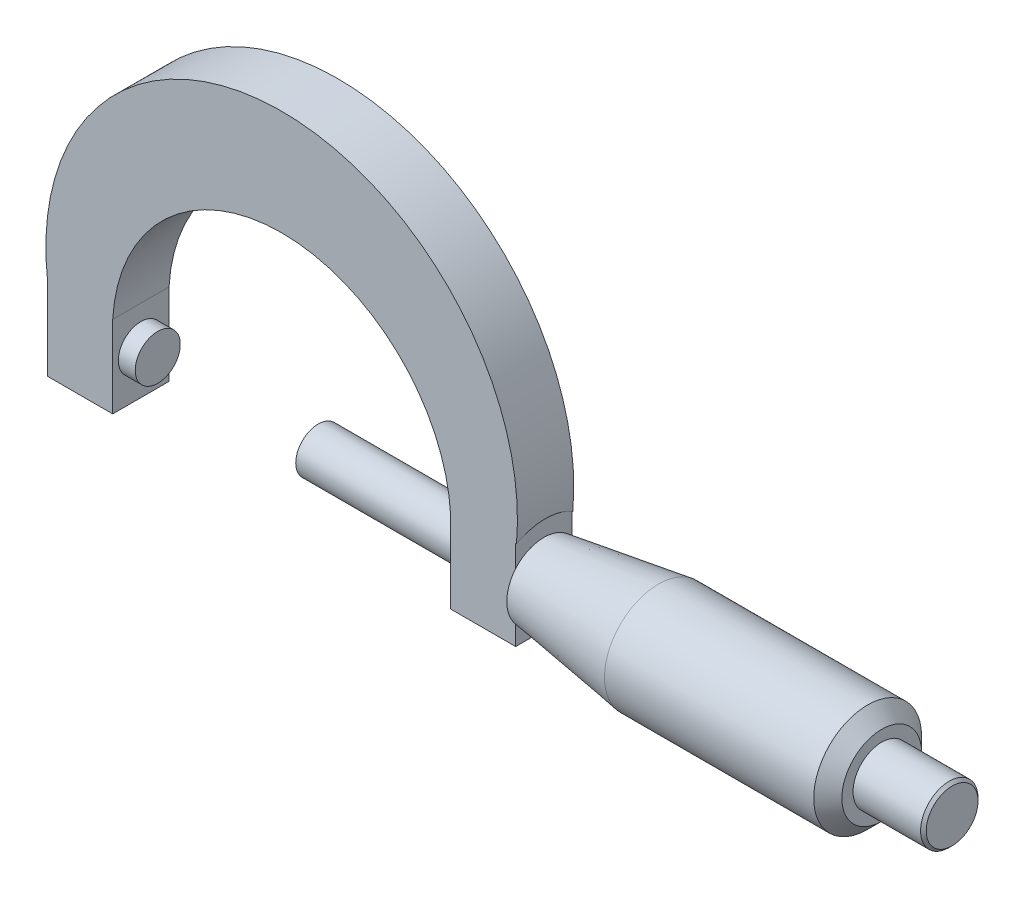
ISO-10303-21;
HEADER;
FILE_DESCRIPTION(('STEP AP214'),'2;1');
FILE_NAME('part.step','',(''),(''),'','','');
FILE_SCHEMA(('AUTOMOTIVE_DESIGN { 1 0 10303 214 1 1 1 1 }'));
ENDSEC;
DATA;
#1=APPLICATION_CONTEXT('core data for automotive mechanical design processes');
#2=APPLICATION_PROTOCOL_DEFINITION('international standard','automotive_design',2000,#1);
#3=PRODUCT_CONTEXT('',#1,'mechanical');
#4=PRODUCT('Part','Part','',(#3));
#5=PRODUCT_RELATED_PRODUCT_CATEGORY('part','',(#4));
#6=PRODUCT_DEFINITION_FORMATION('','',#4);
#7=PRODUCT_DEFINITION_CONTEXT('part definition',#1,'design');
#8=PRODUCT_DEFINITION('design','',#6,#7);
#9=PRODUCT_DEFINITION_SHAPE('','',#8);
#10=(LENGTH_UNIT() NAMED_UNIT(*) SI_UNIT(.MILLI.,.METRE.));
#11=(NAMED_UNIT(*) PLANE_ANGLE_UNIT() SI_UNIT($,.RADIAN.));
#12=(NAMED_UNIT(*) SI_UNIT($,.STERADIAN.) SOLID_ANGLE_UNIT());
#13=UNCERTAINTY_MEASURE_WITH_UNIT(LENGTH_MEASURE(1.E-05),#10,'distance_accuracy_value','');
#14=(GEOMETRIC_REPRESENTATION_CONTEXT(3) GLOBAL_UNCERTAINTY_ASSIGNED_CONTEXT((#13)) GLOBAL_UNIT_ASSIGNED_CONTEXT((#10,
#11,#12)) REPRESENTATION_CONTEXT('',''));
#15=CARTESIAN_POINT('',(0.,0.,0.));
#16=DIRECTION('',(0.,0.,1.));
#17=DIRECTION('',(1.,0.,0.));
#18=AXIS2_PLACEMENT_3D('',#15,#16,#17);
#19=CARTESIAN_POINT('',(21.1105102041848,0.,0.));
#20=DIRECTION('',(1.,0.,0.));
#21=DIRECTION('',(0.,0.,-1.));
#22=AXIS2_PLACEMENT_3D('',#19,#20,#21);
#23=PLANE('',#22);
#24=DIRECTION('',(0.,-1.,0.));
#25=VECTOR('',#24,1.);
#26=CARTESIAN_POINT('',(21.1105102041848,-3.91655101886084,2.54));
#27=LINE('',#26,#25);
#28=CARTESIAN_POINT('',(21.1105102041848,2.17259672592935,2.54));
#29=VERTEX_POINT('',#28);
#30=CARTESIAN_POINT('',(21.1105102041848,-2.17259672592935,2.54));
#31=VERTEX_POINT('',#30);
#32=EDGE_CURVE('E193',#29,#31,#27,.T.);
#33=ORIENTED_EDGE('',*,*,#32,.T.);
#34=CARTESIAN_POINT('',(21.1105102041848,0.,0.));
#35=DIRECTION('',(1.,0.,0.));
#36=DIRECTION('',(0.,0.,-1.));
#37=AXIS2_PLACEMENT_3D('',#34,#35,#36);
#38=CIRCLE('',#37,3.34242075949737);
#39=EDGE_CURVE('E142',#31,#29,#38,.F.);
#40=ORIENTED_EDGE('',*,*,#39,.T.);
#41=EDGE_LOOP('',(#33,#40));
#42=FACE_BOUND('',#41,.T.);
#43=ADVANCED_FACE('F39',(#42),#23,.F.);
#44=DIRECTION('',(0.,-1.,0.));
#45=VECTOR('',#44,1.);
#46=CARTESIAN_POINT('',(21.1105102041848,-3.91655101886084,-2.54));
#47=LINE('',#46,#45);
#48=CARTESIAN_POINT('',(21.1105102041848,2.17259672592935,-2.54));
#49=VERTEX_POINT('',#48);
#50=CARTESIAN_POINT('',(21.1105102041848,-2.17259672592935,-2.54));
#51=VERTEX_POINT('',#50);
#52=EDGE_CURVE('E156',#49,#51,#47,.T.);
#53=ORIENTED_EDGE('',*,*,#52,.F.);
#54=EDGE_CURVE('E133',#49,#51,#38,.F.);
#55=ORIENTED_EDGE('',*,*,#54,.T.);
#56=EDGE_LOOP('',(#53,#55));
#57=FACE_BOUND('',#56,.T.);
#58=ADVANCED_FACE('F157',(#57),#23,.F.);
#59=CARTESIAN_POINT('',(0.,6.08361904921519,2.54));
#60=DIRECTION('',(0.,0.,-1.));
#61=DIRECTION('',(-1.,0.,0.));
#62=AXIS2_PLACEMENT_3D('',#59,#60,#61);
#63=CYLINDRICAL_SURFACE('',#62,21.2716639108442);
#64=CARTESIAN_POINT('',(21.1835693484904,4.14969164788682,-2.54));
#65=CARTESIAN_POINT('',(21.1900594321899,4.22084179336612,-2.4237895843987));
#66=CARTESIAN_POINT('',(21.1957521620569,4.28710102614201,-2.30454559752916));
#67=CARTESIAN_POINT('',(21.2057660920018,4.40940344393565,-2.06088371676479));
#68=CARTESIAN_POINT('',(21.2100873902017,4.46544735970749,-1.93646619374215));
#69=CARTESIAN_POINT('',(21.217578525215,4.56684143347101,-1.68346781722829));
#70=CARTESIAN_POINT('',(21.2207495783246,4.61220286945297,-1.5548915189981));
#71=CARTESIAN_POINT('',(21.2261310367689,4.69198297696005,-1.29436958269519));
#72=CARTESIAN_POINT('',(21.2283414498489,4.72640173671257,-1.16242397179748));
#73=CARTESIAN_POINT('',(21.2319486009122,4.78405053126495,-0.896085379426109));
#74=CARTESIAN_POINT('',(21.2333452529681,4.80727938444812,-0.761692141045575));
#75=CARTESIAN_POINT('',(21.2354262515351,4.84238268823947,-0.491378078538438));
#76=CARTESIAN_POINT('',(21.2361103506572,4.85425319526546,-0.355456740419873));
#77=CARTESIAN_POINT('',(21.2368181706322,4.86654157270807,-0.0830773739447151));
#78=CARTESIAN_POINT('',(21.2368418028732,4.86695790636813,0.0533807239703001));
#79=CARTESIAN_POINT('',(21.2362303107757,4.85633105646733,0.325848540945876));
#80=CARTESIAN_POINT('',(21.2355951862726,4.84528787004251,0.461858259894369));
#81=CARTESIAN_POINT('',(21.2336146602867,4.81177948682671,0.732802056394936));
#82=CARTESIAN_POINT('',(21.232267494618,4.78928592518833,0.867732613481021));
#83=CARTESIAN_POINT('',(21.2287634235388,4.73303336261681,1.1351649062075));
#84=CARTESIAN_POINT('',(21.226606807464,4.69927838752131,1.26766749199036));
#85=CARTESIAN_POINT('',(21.2213424472607,4.62079511828172,1.52918662586984));
#86=CARTESIAN_POINT('',(21.2182358349832,4.57607989498383,1.65820712461491));
#87=CARTESIAN_POINT('',(21.2108876315182,4.47599785235108,1.91195415444148));
#88=CARTESIAN_POINT('',(21.2066466465006,4.42063672624998,2.0366829388092));
#89=CARTESIAN_POINT('',(21.1991095524013,4.32791879312794,2.22394824292265));
#90=CARTESIAN_POINT('',(21.1962963634971,4.29421940998132,2.28833980358013));
#91=CARTESIAN_POINT('',(21.1902541161794,4.22403518427134,2.41543546447965));
#92=CARTESIAN_POINT('',(21.1870257122975,4.18755476174528,2.47814203670695));
#93=CARTESIAN_POINT('',(21.1835693484904,4.14969164788682,2.54));
#94=B_SPLINE_CURVE_WITH_KNOTS('',3,(#64,#65,#66,#67,#68,#69,#70,#71,#72,#73,#74,#75,#76,#77,#78,
#79,#80,#81,#82,#83,#84,#85,#86,#87,#88,#89,#90,#91,#92,#93),.UNSPECIFIED.,.F.,.F.,(4,2,2,2,2,2,
2,2,2,2,2,2,2,2,4),(0.,0.409119300168264,0.818209322436467,1.22686549349716,1.63551836960578,
2.04421438863621,2.45305225421096,2.86194497151459,3.27083779100884,3.68074848421015,
4.09051279536419,4.49979079202602,4.90885051995995,5.1269790624696,5.34476787459818),.UNSPECIFIED.);
#95=CARTESIAN_POINT('',(21.1835693484904,4.14969164788682,-2.54));
#96=VERTEX_POINT('',#95);
#97=CARTESIAN_POINT('',(21.1835693484904,4.14969164788682,2.54));
#98=VERTEX_POINT('',#97);
#99=EDGE_CURVE('E177',#96,#98,#94,.T.);
#100=ORIENTED_EDGE('',*,*,#99,.F.);
#101=CARTESIAN_POINT('',(0.,6.08361904921519,-2.54));
#102=DIRECTION('',(0.,0.,1.));
#103=DIRECTION('',(-1.,0.,0.));
#104=AXIS2_PLACEMENT_3D('',#101,#102,#103);
#105=CIRCLE('',#104,21.2716639108442);
#106=CARTESIAN_POINT('',(-21.1105102041848,3.47018367505279,-2.54));
#107=VERTEX_POINT('',#106);
#108=EDGE_CURVE('E86',#96,#107,#105,.T.);
#109=ORIENTED_EDGE('',*,*,#108,.T.);
#110=DIRECTION('',(0.,0.,-1.));
#111=VECTOR('',#110,1.);
#112=CARTESIAN_POINT('',(-21.1105102041848,3.47018367505279,2.54));
#113=LINE('',#112,#111);
#114=CARTESIAN_POINT('',(-21.1105102041848,3.47018367505279,2.54));
#115=VERTEX_POINT('',#114);
#116=EDGE_CURVE('E230',#115,#107,#113,.T.);
#117=ORIENTED_EDGE('',*,*,#116,.F.);
#118=CARTESIAN_POINT('',(0.,6.08361904921519,2.54));
#119=DIRECTION('',(0.,0.,1.));
#120=DIRECTION('',(-1.,0.,0.));
#121=AXIS2_PLACEMENT_3D('',#118,#119,#120);
#122=CIRCLE('',#121,21.2716639108442);
#123=EDGE_CURVE('E64',#98,#115,#122,.T.);
#124=ORIENTED_EDGE('',*,*,#123,.F.);
#125=EDGE_LOOP('',(#100,#109,#117,#124));
#126=FACE_BOUND('',#125,.T.);
#127=ADVANCED_FACE('F299',(#126),#63,.T.);
#128=CARTESIAN_POINT('',(0.,6.08361904921519,2.54));
#129=DIRECTION('',(0.,0.,-1.));
#130=DIRECTION('',(-1.,0.,0.));
#131=AXIS2_PLACEMENT_3D('',#128,#129,#130);
#132=PLANE('',#131);
#133=DIRECTION('',(-1.,0.,0.));
#134=VECTOR('',#133,1.);
#135=CARTESIAN_POINT('',(51.5905102041848,4.14969164788682,2.54));
#136=LINE('',#135,#134);
#137=CARTESIAN_POINT('',(21.1105102041848,4.14969164788682,2.54));
#138=VERTEX_POINT('',#137);
#139=EDGE_CURVE('E173',#98,#138,#136,.T.);
#140=ORIENTED_EDGE('',*,*,#139,.F.);
#141=ORIENTED_EDGE('',*,*,#123,.T.);
#142=DIRECTION('',(0.,-1.,0.));
#143=VECTOR('',#142,1.);
#144=CARTESIAN_POINT('',(-21.1105102041848,-3.91655101886084,2.54));
#145=LINE('',#144,#143);
#146=CARTESIAN_POINT('',(-21.1105102041848,-3.91655101886084,2.54));
#147=VERTEX_POINT('',#146);
#148=EDGE_CURVE('E217',#115,#147,#145,.T.);
#149=ORIENTED_EDGE('',*,*,#148,.T.);
#150=DIRECTION('',(1.,0.,0.));
#151=VECTOR('',#150,1.);
#152=CARTESIAN_POINT('',(-21.1105102041848,-3.91655101886084,2.54));
#153=LINE('',#152,#151);
#154=CARTESIAN_POINT('',(-15.2400000000744,-3.91655101886084,2.54));
#155=VERTEX_POINT('',#154);
#156=EDGE_CURVE('E94',#147,#155,#153,.T.);
#157=ORIENTED_EDGE('',*,*,#156,.T.);
#158=DIRECTION('',(0.,1.,0.));
#159=VECTOR('',#158,1.);
#160=CARTESIAN_POINT('',(-15.2400000000744,-3.91655101886084,2.54));
#161=LINE('',#160,#159);
#162=CARTESIAN_POINT('',(-15.2400000000744,3.47018367505279,2.54));
#163=VERTEX_POINT('',#162);
#164=EDGE_CURVE('E222',#155,#163,#161,.T.);
#165=ORIENTED_EDGE('',*,*,#164,.T.);
#166=CARTESIAN_POINT('',(0.,2.5933282814625,2.54));
#167=DIRECTION('',(0.,0.,-1.));
#168=DIRECTION('',(-1.,0.,0.));
#169=AXIS2_PLACEMENT_3D('',#166,#167,#168);
#170=CIRCLE('',#169,15.2652047278619);
#171=CARTESIAN_POINT('',(15.2400000000744,3.47018367505279,2.54));
#172=VERTEX_POINT('',#171);
#173=EDGE_CURVE('E225',#163,#172,#170,.T.);
#174=ORIENTED_EDGE('',*,*,#173,.T.);
#175=DIRECTION('',(0.,1.,0.));
#176=VECTOR('',#175,1.);
#177=CARTESIAN_POINT('',(15.2400000000744,-3.91655101886084,2.54));
#178=LINE('',#177,#176);
#179=CARTESIAN_POINT('',(15.2400000000744,-3.91655101886084,2.54));
#180=VERTEX_POINT('',#179);
#181=EDGE_CURVE('E192',#180,#172,#178,.T.);
#182=ORIENTED_EDGE('',*,*,#181,.F.);
#183=DIRECTION('',(-1.,0.,0.));
#184=VECTOR('',#183,1.);
#185=CARTESIAN_POINT('',(21.1105102041848,-3.91655101886084,2.54));
#186=LINE('',#185,#184);
#187=CARTESIAN_POINT('',(21.1105102041848,-3.91655101886084,2.54));
#188=VERTEX_POINT('',#187);
#189=EDGE_CURVE('E197',#188,#180,#186,.T.);
#190=ORIENTED_EDGE('',*,*,#189,.F.);
#191=EDGE_CURVE('E194',#31,#188,#27,.T.);
#192=ORIENTED_EDGE('',*,*,#191,.F.);
#193=ORIENTED_EDGE('',*,*,#32,.F.);
#194=EDGE_CURVE('E152',#138,#29,#27,.T.);
#195=ORIENTED_EDGE('',*,*,#194,.F.);
#196=EDGE_LOOP('',(#140,#141,#149,#157,#165,#174,#182,#190,#192,#193,#195));
#197=FACE_BOUND('',#196,.T.);
#198=ADVANCED_FACE('F317',(#197),#132,.F.);
#199=CARTESIAN_POINT('',(0.,6.08361904921519,-2.54));
#200=DIRECTION('',(0.,0.,-1.));
#201=DIRECTION('',(-1.,0.,0.));
#202=AXIS2_PLACEMENT_3D('',#199,#200,#201);
#203=PLANE('',#202);
#204=ORIENTED_EDGE('',*,*,#108,.F.);
#205=DIRECTION('',(-1.,0.,0.));
#206=VECTOR('',#205,1.);
#207=CARTESIAN_POINT('',(51.5905102041848,4.14969164788682,-2.54));
#208=LINE('',#207,#206);
#209=CARTESIAN_POINT('',(21.1105102041848,4.14969164788682,-2.54));
#210=VERTEX_POINT('',#209);
#211=EDGE_CURVE('E143',#96,#210,#208,.T.);
#212=ORIENTED_EDGE('',*,*,#211,.T.);
#213=EDGE_CURVE('E149',#210,#49,#47,.T.);
#214=ORIENTED_EDGE('',*,*,#213,.T.);
#215=ORIENTED_EDGE('',*,*,#52,.T.);
#216=CARTESIAN_POINT('',(21.1105102041848,-3.91655101886084,-2.54));
#217=VERTEX_POINT('',#216);
#218=EDGE_CURVE('E161',#51,#217,#47,.T.);
#219=ORIENTED_EDGE('',*,*,#218,.T.);
#220=DIRECTION('',(-1.,0.,0.));
#221=VECTOR('',#220,1.);
#222=CARTESIAN_POINT('',(21.1105102041848,-3.91655101886084,-2.54));
#223=LINE('',#222,#221);
#224=CARTESIAN_POINT('',(15.2400000000744,-3.91655101886084,-2.54));
#225=VERTEX_POINT('',#224);
#226=EDGE_CURVE('E169',#217,#225,#223,.T.);
#227=ORIENTED_EDGE('',*,*,#226,.T.);
#228=DIRECTION('',(0.,1.,0.));
#229=VECTOR('',#228,1.);
#230=CARTESIAN_POINT('',(15.2400000000744,-3.91655101886084,-2.54));
#231=LINE('',#230,#229);
#232=CARTESIAN_POINT('',(15.2400000000744,3.47018367505279,-2.54));
#233=VERTEX_POINT('',#232);
#234=EDGE_CURVE('E166',#225,#233,#231,.T.);
#235=ORIENTED_EDGE('',*,*,#234,.T.);
#236=CARTESIAN_POINT('',(0.,2.5933282814625,-2.54));
#237=DIRECTION('',(0.,0.,-1.));
#238=DIRECTION('',(-1.,0.,0.));
#239=AXIS2_PLACEMENT_3D('',#236,#237,#238);
#240=CIRCLE('',#239,15.2652047278619);
#241=CARTESIAN_POINT('',(-15.2400000000744,3.47018367505279,-2.54));
#242=VERTEX_POINT('',#241);
#243=EDGE_CURVE('E240',#242,#233,#240,.T.);
#244=ORIENTED_EDGE('',*,*,#243,.F.);
#245=DIRECTION('',(0.,1.,0.));
#246=VECTOR('',#245,1.);
#247=CARTESIAN_POINT('',(-15.2400000000744,-3.91655101886084,-2.54));
#248=LINE('',#247,#246);
#249=CARTESIAN_POINT('',(-15.2400000000744,-3.91655101886084,-2.54));
#250=VERTEX_POINT('',#249);
#251=EDGE_CURVE('E237',#250,#242,#248,.T.);
#252=ORIENTED_EDGE('',*,*,#251,.F.);
#253=DIRECTION('',(1.,0.,0.));
#254=VECTOR('',#253,1.);
#255=CARTESIAN_POINT('',(-21.1105102041848,-3.91655101886084,-2.54));
#256=LINE('',#255,#254);
#257=CARTESIAN_POINT('',(-21.1105102041848,-3.91655101886084,-2.54));
#258=VERTEX_POINT('',#257);
#259=EDGE_CURVE('E234',#258,#250,#256,.T.);
#260=ORIENTED_EDGE('',*,*,#259,.F.);
#261=DIRECTION('',(0.,-1.,0.));
#262=VECTOR('',#261,1.);
#263=CARTESIAN_POINT('',(-21.1105102041848,-3.91655101886084,-2.54));
#264=LINE('',#263,#262);
#265=EDGE_CURVE('E216',#107,#258,#264,.T.);
#266=ORIENTED_EDGE('',*,*,#265,.F.);
#267=EDGE_LOOP('',(#204,#212,#214,#215,#219,#227,#235,#244,#252,#260,#266));
#268=FACE_BOUND('',#267,.T.);
#269=ADVANCED_FACE('F164',(#268),#203,.T.);
#270=CARTESIAN_POINT('',(-21.1105102041848,-3.91655101886084,2.54));
#271=DIRECTION('',(1.,0.,0.));
#272=DIRECTION('',(0.,0.,-1.));
#273=AXIS2_PLACEMENT_3D('',#270,#271,#272);
#274=PLANE('',#273);
#275=ORIENTED_EDGE('',*,*,#265,.T.);
#276=DIRECTION('',(0.,0.,-1.));
#277=VECTOR('',#276,1.);
#278=CARTESIAN_POINT('',(-21.1105102041848,-3.91655101886084,2.54));
#279=LINE('',#278,#277);
#280=EDGE_CURVE('E255',#147,#258,#279,.T.);
#281=ORIENTED_EDGE('',*,*,#280,.F.);
#282=ORIENTED_EDGE('',*,*,#148,.F.);
#283=ORIENTED_EDGE('',*,*,#116,.T.);
#284=EDGE_LOOP('',(#275,#281,#282,#283));
#285=FACE_BOUND('',#284,.T.);
#286=ADVANCED_FACE('F321',(#285),#274,.F.);
#287=CARTESIAN_POINT('',(-21.1105102041848,-3.91655101886084,2.54));
#288=DIRECTION('',(0.,1.,0.));
#289=DIRECTION('',(0.,0.,1.));
#290=AXIS2_PLACEMENT_3D('',#287,#288,#289);
#291=PLANE('',#290);
#292=ORIENTED_EDGE('',*,*,#259,.T.);
#293=DIRECTION('',(0.,0.,-1.));
#294=VECTOR('',#293,1.);
#295=CARTESIAN_POINT('',(-15.2400000000744,-3.91655101886084,2.54));
#296=LINE('',#295,#294);
#297=EDGE_CURVE('E251',#155,#250,#296,.T.);
#298=ORIENTED_EDGE('',*,*,#297,.F.);
#299=ORIENTED_EDGE('',*,*,#156,.F.);
#300=ORIENTED_EDGE('',*,*,#280,.T.);
#301=EDGE_LOOP('',(#292,#298,#299,#300));
#302=FACE_BOUND('',#301,.T.);
#303=ADVANCED_FACE('F331',(#302),#291,.F.);
#304=CARTESIAN_POINT('',(-15.2400000000744,-3.91655101886084,2.54));
#305=DIRECTION('',(-1.,0.,0.));
#306=DIRECTION('',(0.,0.,1.));
#307=AXIS2_PLACEMENT_3D('',#304,#305,#306);
#308=PLANE('',#307);
#309=CARTESIAN_POINT('',(-15.2400000000744,0.,0.));
#310=DIRECTION('',(-1.,0.,0.));
#311=DIRECTION('',(0.,0.,1.));
#312=AXIS2_PLACEMENT_3D('',#309,#310,#311);
#313=CIRCLE('',#312,2.032);
#314=CARTESIAN_POINT('',(-15.2400000000744,0.,2.032));
#315=VERTEX_POINT('',#314);
#316=EDGE_CURVE('E11',#315,#315,#313,.F.);
#317=ORIENTED_EDGE('',*,*,#316,.F.);
#318=EDGE_LOOP('',(#317));
#319=FACE_BOUND('',#318,.T.);
#320=ORIENTED_EDGE('',*,*,#251,.T.);
#321=DIRECTION('',(0.,0.,-1.));
#322=VECTOR('',#321,1.);
#323=CARTESIAN_POINT('',(-15.2400000000744,3.47018367505279,2.54));
#324=LINE('',#323,#322);
#325=EDGE_CURVE('E247',#163,#242,#324,.T.);
#326=ORIENTED_EDGE('',*,*,#325,.F.);
#327=ORIENTED_EDGE('',*,*,#164,.F.);
#328=ORIENTED_EDGE('',*,*,#297,.T.);
#329=EDGE_LOOP('',(#320,#326,#327,#328));
#330=FACE_BOUND('',#329,.T.);
#331=ADVANCED_FACE('F327',(#319,#330),#308,.F.);
#332=CARTESIAN_POINT('',(0.,2.5933282814625,2.54));
#333=DIRECTION('',(0.,0.,-1.));
#334=DIRECTION('',(-1.,0.,0.));
#335=AXIS2_PLACEMENT_3D('',#332,#333,#334);
#336=CYLINDRICAL_SURFACE('',#335,15.2652047278619);
#337=ORIENTED_EDGE('',*,*,#243,.T.);
#338=DIRECTION('',(0.,0.,-1.));
#339=VECTOR('',#338,1.);
#340=CARTESIAN_POINT('',(15.2400000000744,3.47018367505279,2.54));
#341=LINE('',#340,#339);
#342=EDGE_CURVE('E209',#172,#233,#341,.T.);
#343=ORIENTED_EDGE('',*,*,#342,.F.);
#344=ORIENTED_EDGE('',*,*,#173,.F.);
#345=ORIENTED_EDGE('',*,*,#325,.T.);
#346=EDGE_LOOP('',(#337,#343,#344,#345));
#347=FACE_BOUND('',#346,.T.);
#348=ADVANCED_FACE('F315',(#347),#336,.F.);
#349=CARTESIAN_POINT('',(15.2400000000744,-3.91655101886084,2.54));
#350=DIRECTION('',(-1.,0.,0.));
#351=DIRECTION('',(0.,0.,1.));
#352=AXIS2_PLACEMENT_3D('',#349,#350,#351);
#353=PLANE('',#352);
#354=CARTESIAN_POINT('',(15.2400000000744,0.,0.));
#355=DIRECTION('',(-1.,0.,0.));
#356=DIRECTION('',(0.,0.,1.));
#357=AXIS2_PLACEMENT_3D('',#354,#355,#356);
#358=CIRCLE('',#357,2.032);
#359=CARTESIAN_POINT('',(15.2400000000744,0.,2.032));
#360=VERTEX_POINT('',#359);
#361=EDGE_CURVE('E502',#360,#360,#358,.T.);
#362=ORIENTED_EDGE('',*,*,#361,.F.);
#363=EDGE_LOOP('',(#362));
#364=FACE_BOUND('',#363,.T.);
#365=ORIENTED_EDGE('',*,*,#234,.F.);
#366=DIRECTION('',(0.,0.,-1.));
#367=VECTOR('',#366,1.);
#368=CARTESIAN_POINT('',(15.2400000000744,-3.91655101886084,2.54));
#369=LINE('',#368,#367);
#370=EDGE_CURVE('E205',#180,#225,#369,.T.);
#371=ORIENTED_EDGE('',*,*,#370,.F.);
#372=ORIENTED_EDGE('',*,*,#181,.T.);
#373=ORIENTED_EDGE('',*,*,#342,.T.);
#374=EDGE_LOOP('',(#365,#371,#372,#373));
#375=FACE_BOUND('',#374,.T.);
#376=ADVANCED_FACE('F312',(#364,#375),#353,.T.);
#377=CARTESIAN_POINT('',(21.1105102041848,-3.91655101886084,2.54));
#378=DIRECTION('',(0.,-1.,0.));
#379=DIRECTION('',(0.,0.,-1.));
#380=AXIS2_PLACEMENT_3D('',#377,#378,#379);
#381=PLANE('',#380);
#382=ORIENTED_EDGE('',*,*,#226,.F.);
#383=DIRECTION('',(0.,0.,-1.));
#384=VECTOR('',#383,1.);
#385=CARTESIAN_POINT('',(21.1105102041848,-3.91655101886084,2.54));
#386=LINE('',#385,#384);
#387=EDGE_CURVE('E200',#188,#217,#386,.T.);
#388=ORIENTED_EDGE('',*,*,#387,.F.);
#389=ORIENTED_EDGE('',*,*,#189,.T.);
#390=ORIENTED_EDGE('',*,*,#370,.T.);
#391=EDGE_LOOP('',(#382,#388,#389,#390));
#392=FACE_BOUND('',#391,.T.);
#393=ADVANCED_FACE('F309',(#392),#381,.T.);
#394=CARTESIAN_POINT('',(21.1105102041848,3.34242075949737,0.));
#395=DIRECTION('',(-1.,0.,0.));
#396=DIRECTION('',(0.,0.,1.));
#397=AXIS2_PLACEMENT_3D('',#394,#395,#396);
#398=PLANE('',#397);
#399=CARTESIAN_POINT('',(21.1105102041848,0.,0.));
#400=DIRECTION('',(1.,0.,0.));
#401=DIRECTION('',(0.,0.,-1.));
#402=AXIS2_PLACEMENT_3D('',#399,#400,#401);
#403=CIRCLE('',#402,3.34242075949737);
#404=EDGE_CURVE('E136',#49,#29,#403,.T.);
#405=ORIENTED_EDGE('',*,*,#404,.F.);
#406=ORIENTED_EDGE('',*,*,#213,.F.);
#407=CARTESIAN_POINT('',(21.1105102041848,0.,0.));
#408=DIRECTION('',(1.,0.,0.));
#409=DIRECTION('',(0.,0.,-1.));
#410=AXIS2_PLACEMENT_3D('',#407,#408,#409);
#411=CIRCLE('',#410,4.86534076633299);
#412=EDGE_CURVE('E154',#210,#138,#411,.T.);
#413=ORIENTED_EDGE('',*,*,#412,.T.);
#414=ORIENTED_EDGE('',*,*,#194,.T.);
#415=EDGE_LOOP('',(#405,#406,#413,#414));
#416=FACE_BOUND('',#415,.T.);
#417=ADVANCED_FACE('F146',(#416),#398,.F.);
#418=ORIENTED_EDGE('',*,*,#387,.T.);
#419=ORIENTED_EDGE('',*,*,#218,.F.);
#420=EDGE_CURVE('E55',#31,#51,#403,.T.);
#421=ORIENTED_EDGE('',*,*,#420,.F.);
#422=ORIENTED_EDGE('',*,*,#191,.T.);
#423=EDGE_LOOP('',(#418,#419,#421,#422));
#424=FACE_BOUND('',#423,.T.);
#425=ADVANCED_FACE('F384',(#424),#398,.F.);
#426=CARTESIAN_POINT('',(51.5905102041848,0.,0.));
#427=DIRECTION('',(1.,0.,0.));
#428=DIRECTION('',(0.,0.,-1.));
#429=AXIS2_PLACEMENT_3D('',#426,#427,#428);
#430=CYLINDRICAL_SURFACE('',#429,4.86534076633299);
#431=ORIENTED_EDGE('',*,*,#412,.F.);
#432=ORIENTED_EDGE('',*,*,#211,.F.);
#433=ORIENTED_EDGE('',*,*,#99,.T.);
#434=ORIENTED_EDGE('',*,*,#139,.T.);
#435=EDGE_LOOP('',(#431,#432,#433,#434));
#436=FACE_BOUND('',#435,.T.);
#437=ADVANCED_FACE('F350',(#436),#430,.F.);
#438=CARTESIAN_POINT('',(21.1105102041848,0.,0.));
#439=DIRECTION('',(1.,0.,0.));
#440=DIRECTION('',(0.,0.,-1.));
#441=AXIS2_PLACEMENT_3D('',#438,#439,#440);
#442=CONICAL_SURFACE('',#441,3.34242075949737,0.146297324440882);
#443=CARTESIAN_POINT('',(31.4458974460131,0.,0.));
#444=DIRECTION('',(1.,0.,0.));
#445=DIRECTION('',(0.,0.,-1.));
#446=AXIS2_PLACEMENT_3D('',#443,#444,#445);
#447=CIRCLE('',#446,4.86534076633299);
#448=CARTESIAN_POINT('',(31.4458974460131,0.,-4.86534076633299));
#449=VERTEX_POINT('',#448);
#450=EDGE_CURVE('E361',#449,#449,#447,.T.);
#451=ORIENTED_EDGE('',*,*,#450,.F.);
#452=EDGE_LOOP('',(#451));
#453=FACE_BOUND('',#452,.T.);
#454=ORIENTED_EDGE('',*,*,#404,.T.);
#455=ORIENTED_EDGE('',*,*,#39,.F.);
#456=ORIENTED_EDGE('',*,*,#420,.T.);
#457=ORIENTED_EDGE('',*,*,#54,.F.);
#458=EDGE_LOOP('',(#454,#455,#456,#457));
#459=FACE_BOUND('',#458,.T.);
#460=ADVANCED_FACE('F135',(#453,#459),#442,.T.);
#461=CARTESIAN_POINT('',(51.5905102041848,0.,0.));
#462=DIRECTION('',(1.,0.,0.));
#463=DIRECTION('',(0.,0.,-1.));
#464=AXIS2_PLACEMENT_3D('',#461,#462,#463);
#465=PLANE('',#464);
#466=CARTESIAN_POINT('',(51.5905102041848,0.,0.));
#467=DIRECTION('',(1.,0.,0.));
#468=DIRECTION('',(0.,0.,-1.));
#469=AXIS2_PLACEMENT_3D('',#466,#467,#468);
#470=CIRCLE('',#469,2.59008251069091);
#471=CARTESIAN_POINT('',(51.5905102041848,0.,-2.59008251069091));
#472=VERTEX_POINT('',#471);
#473=EDGE_CURVE('E268',#472,#472,#470,.T.);
#474=ORIENTED_EDGE('',*,*,#473,.F.);
#475=EDGE_LOOP('',(#474));
#476=FACE_BOUND('',#475,.T.);
#477=CARTESIAN_POINT('',(51.5905102041848,0.,0.));
#478=DIRECTION('',(1.,0.,0.));
#479=DIRECTION('',(0.,0.,-1.));
#480=AXIS2_PLACEMENT_3D('',#477,#478,#479);
#481=CIRCLE('',#480,3.59534076633299);
#482=CARTESIAN_POINT('',(51.5905102041848,0.,-3.59534076633299));
#483=VERTEX_POINT('',#482);
#484=EDGE_CURVE('E260',#483,#483,#481,.T.);
#485=ORIENTED_EDGE('',*,*,#484,.T.);
#486=EDGE_LOOP('',(#485));
#487=FACE_BOUND('',#486,.T.);
#488=ADVANCED_FACE('F302',(#476,#487),#465,.T.);
#489=CARTESIAN_POINT('',(51.5905102041848,0.,0.));
#490=DIRECTION('',(-1.,0.,0.));
#491=DIRECTION('',(0.,0.,1.));
#492=AXIS2_PLACEMENT_3D('',#489,#490,#491);
#493=CYLINDRICAL_SURFACE('',#492,4.86534076633299);
#494=CARTESIAN_POINT('',(50.3205102041848,0.,0.));
#495=DIRECTION('',(1.,0.,0.));
#496=DIRECTION('',(0.,0.,-1.));
#497=AXIS2_PLACEMENT_3D('',#494,#495,#496);
#498=CIRCLE('',#497,4.86534076633299);
#499=CARTESIAN_POINT('',(50.3205102041848,0.,-4.86534076633299));
#500=VERTEX_POINT('',#499);
#501=EDGE_CURVE('E264',#500,#500,#498,.F.);
#502=ORIENTED_EDGE('',*,*,#501,.T.);
#503=EDGE_LOOP('',(#502));
#504=FACE_BOUND('',#503,.T.);
#505=ORIENTED_EDGE('',*,*,#450,.T.);
#506=EDGE_LOOP('',(#505));
#507=FACE_BOUND('',#506,.T.);
#508=ADVANCED_FACE('F304',(#504,#507),#493,.T.);
#509=CARTESIAN_POINT('',(51.5905102041848,0.,0.));
#510=DIRECTION('',(-1.,0.,0.));
#511=DIRECTION('',(0.,0.,1.));
#512=AXIS2_PLACEMENT_3D('',#509,#510,#511);
#513=CONICAL_SURFACE('',#512,3.59534076633299,0.785398163397447);
#514=ORIENTED_EDGE('',*,*,#501,.F.);
#515=EDGE_LOOP('',(#514));
#516=FACE_BOUND('',#515,.T.);
#517=ORIENTED_EDGE('',*,*,#484,.F.);
#518=EDGE_LOOP('',(#517));
#519=FACE_BOUND('',#518,.T.);
#520=ADVANCED_FACE('F290',(#516,#519),#513,.T.);
#521=CARTESIAN_POINT('',(57.9405102041849,0.,0.));
#522=DIRECTION('',(-1.,0.,0.));
#523=DIRECTION('',(0.,0.,1.));
#524=AXIS2_PLACEMENT_3D('',#521,#522,#523);
#525=CYLINDRICAL_SURFACE('',#524,2.59008251069091);
#526=CARTESIAN_POINT('',(57.6865102041849,0.,0.));
#527=DIRECTION('',(1.,0.,0.));
#528=DIRECTION('',(0.,0.,-1.));
#529=AXIS2_PLACEMENT_3D('',#526,#527,#528);
#530=CIRCLE('',#529,2.59008251069091);
#531=CARTESIAN_POINT('',(57.6865102041849,0.,-2.59008251069091));
#532=VERTEX_POINT('',#531);
#533=EDGE_CURVE('E48',#532,#532,#530,.F.);
#534=ORIENTED_EDGE('',*,*,#533,.T.);
#535=EDGE_LOOP('',(#534));
#536=FACE_BOUND('',#535,.T.);
#537=ORIENTED_EDGE('',*,*,#473,.T.);
#538=EDGE_LOOP('',(#537));
#539=FACE_BOUND('',#538,.T.);
#540=ADVANCED_FACE('F276',(#536,#539),#525,.T.);
#541=CARTESIAN_POINT('',(57.9405102041849,0.,0.));
#542=DIRECTION('',(1.,0.,0.));
#543=DIRECTION('',(0.,0.,-1.));
#544=AXIS2_PLACEMENT_3D('',#541,#542,#543);
#545=PLANE('',#544);
#546=CARTESIAN_POINT('',(57.9405102041849,0.,0.));
#547=DIRECTION('',(1.,0.,0.));
#548=DIRECTION('',(0.,0.,-1.));
#549=AXIS2_PLACEMENT_3D('',#546,#547,#548);
#550=CIRCLE('',#549,2.33608251069093);
#551=CARTESIAN_POINT('',(57.9405102041849,0.,-2.33608251069093));
#552=VERTEX_POINT('',#551);
#553=EDGE_CURVE('E269',#552,#552,#550,.T.);
#554=ORIENTED_EDGE('',*,*,#553,.T.);
#555=EDGE_LOOP('',(#554));
#556=FACE_BOUND('',#555,.T.);
#557=ADVANCED_FACE('F282',(#556),#545,.T.);
#558=CARTESIAN_POINT('',(57.9405102041849,0.,0.));
#559=DIRECTION('',(-1.,0.,0.));
#560=DIRECTION('',(0.,0.,1.));
#561=AXIS2_PLACEMENT_3D('',#558,#559,#560);
#562=CONICAL_SURFACE('',#561,2.33608251069093,0.785398163397447);
#563=ORIENTED_EDGE('',*,*,#533,.F.);
#564=EDGE_LOOP('',(#563));
#565=FACE_BOUND('',#564,.T.);
#566=ORIENTED_EDGE('',*,*,#553,.F.);
#567=EDGE_LOOP('',(#566));
#568=FACE_BOUND('',#567,.T.);
#569=ADVANCED_FACE('F41',(#565,#568),#562,.T.);
#570=CARTESIAN_POINT('',(-13.7160000000744,0.,0.));
#571=DIRECTION('',(-1.,0.,0.));
#572=DIRECTION('',(0.,0.,1.));
#573=AXIS2_PLACEMENT_3D('',#570,#571,#572);
#574=CYLINDRICAL_SURFACE('',#573,2.032);
#575=CARTESIAN_POINT('',(-13.7160000000744,0.,0.));
#576=DIRECTION('',(1.,0.,0.));
#577=DIRECTION('',(0.,0.,-1.));
#578=AXIS2_PLACEMENT_3D('',#575,#576,#577);
#579=CIRCLE('',#578,2.032);
#580=CARTESIAN_POINT('',(-13.7160000000745,0.,2.032));
#581=VERTEX_POINT('',#580);
#582=EDGE_CURVE('E359',#581,#581,#579,.T.);
#583=CARTESIAN_POINT('',(-13.7160000000745,0.,2.032));
#584=CARTESIAN_POINT('',(-13.7318750000745,0.,2.032));
#585=CARTESIAN_POINT('',(-13.7477500000745,0.,2.032));
#586=CARTESIAN_POINT('',(-13.7795000000745,0.,2.032));
#587=CARTESIAN_POINT('',(-13.7953750000745,0.,2.032));
#588=CARTESIAN_POINT('',(-13.8271250000745,0.,2.032));
#589=CARTESIAN_POINT('',(-13.8430000000745,0.,2.032));
#590=CARTESIAN_POINT('',(-13.8747500000745,0.,2.032));
#591=CARTESIAN_POINT('',(-13.8906250000745,0.,2.032));
#592=CARTESIAN_POINT('',(-13.9223750000745,0.,2.032));
#593=CARTESIAN_POINT('',(-13.9382500000745,0.,2.032));
#594=CARTESIAN_POINT('',(-13.9700000000745,0.,2.032));
#595=CARTESIAN_POINT('',(-13.9858750000745,0.,2.032));
#596=CARTESIAN_POINT('',(-14.0176250000745,0.,2.032));
#597=CARTESIAN_POINT('',(-14.0335000000745,0.,2.032));
#598=CARTESIAN_POINT('',(-14.0652500000745,0.,2.032));
#599=CARTESIAN_POINT('',(-14.0811250000745,0.,2.032));
#600=CARTESIAN_POINT('',(-14.1128750000745,0.,2.032));
#601=CARTESIAN_POINT('',(-14.1287500000744,0.,2.032));
#602=CARTESIAN_POINT('',(-14.1605000000744,0.,2.032));
#603=CARTESIAN_POINT('',(-14.1763750000745,0.,2.032));
#604=CARTESIAN_POINT('',(-14.2081250000745,0.,2.032));
#605=CARTESIAN_POINT('',(-14.2240000000744,0.,2.032));
#606=CARTESIAN_POINT('',(-14.2557500000744,0.,2.032));
#607=CARTESIAN_POINT('',(-14.2716250000745,0.,2.032));
#608=CARTESIAN_POINT('',(-14.3033750000745,0.,2.032));
#609=CARTESIAN_POINT('',(-14.3192500000744,0.,2.032));
#610=CARTESIAN_POINT('',(-14.3510000000744,0.,2.032));
#611=CARTESIAN_POINT('',(-14.3668750000745,0.,2.032));
#612=CARTESIAN_POINT('',(-14.3986250000745,0.,2.032));
#613=CARTESIAN_POINT('',(-14.4145000000744,0.,2.032));
#614=CARTESIAN_POINT('',(-14.4462500000744,0.,2.032));
#615=CARTESIAN_POINT('',(-14.4621250000745,0.,2.032));
#616=CARTESIAN_POINT('',(-14.4938750000744,0.,2.032));
#617=CARTESIAN_POINT('',(-14.5097500000744,0.,2.032));
#618=CARTESIAN_POINT('',(-14.5415000000744,0.,2.032));
#619=CARTESIAN_POINT('',(-14.5573750000744,0.,2.032));
#620=CARTESIAN_POINT('',(-14.5891250000744,0.,2.032));
#621=CARTESIAN_POINT('',(-14.6050000000744,0.,2.032));
#622=CARTESIAN_POINT('',(-14.6367500000744,0.,2.032));
#623=CARTESIAN_POINT('',(-14.6526250000744,0.,2.032));
#624=CARTESIAN_POINT('',(-14.6843750000744,0.,2.032));
#625=CARTESIAN_POINT('',(-14.7002500000744,0.,2.032));
#626=CARTESIAN_POINT('',(-14.7320000000744,0.,2.032));
#627=CARTESIAN_POINT('',(-14.7478750000744,0.,2.032));
#628=CARTESIAN_POINT('',(-14.7796250000745,0.,2.032));
#629=CARTESIAN_POINT('',(-14.7955000000744,0.,2.032));
#630=CARTESIAN_POINT('',(-14.8272500000745,0.,2.032));
#631=CARTESIAN_POINT('',(-14.8431250000744,0.,2.032));
#632=CARTESIAN_POINT('',(-14.8748750000745,0.,2.032));
#633=CARTESIAN_POINT('',(-14.8907500000744,0.,2.032));
#634=CARTESIAN_POINT('',(-14.9225000000744,0.,2.032));
#635=CARTESIAN_POINT('',(-14.9383750000744,0.,2.032));
#636=CARTESIAN_POINT('',(-14.9701250000745,0.,2.032));
#637=CARTESIAN_POINT('',(-14.9860000000744,0.,2.032));
#638=CARTESIAN_POINT('',(-15.0177500000744,0.,2.032));
#639=CARTESIAN_POINT('',(-15.0336250000744,0.,2.032));
#640=CARTESIAN_POINT('',(-15.0653750000745,0.,2.032));
#641=CARTESIAN_POINT('',(-15.0812500000744,0.,2.032));
#642=CARTESIAN_POINT('',(-15.1130000000744,0.,2.032));
#643=CARTESIAN_POINT('',(-15.1288750000744,0.,2.032));
#644=CARTESIAN_POINT('',(-15.1606250000745,0.,2.032));
#645=CARTESIAN_POINT('',(-15.1765000000744,0.,2.032));
#646=CARTESIAN_POINT('',(-15.2082500000744,0.,2.032));
#647=CARTESIAN_POINT('',(-15.2241250000744,0.,2.032));
#648=CARTESIAN_POINT('',(-15.2400000000744,0.,2.032));
#649=B_SPLINE_CURVE_WITH_KNOTS('',3,(#583,#584,#585,#586,#587,#588,#589,#590,#591,#592,#593,
#594,#595,#596,#597,#598,#599,#600,#601,#602,#603,#604,#605,#606,#607,#608,#609,#610,#611,#612,
#613,#614,#615,#616,#617,#618,#619,#620,#621,#622,#623,#624,#625,#626,#627,#628,#629,#630,#631,
#632,#633,#634,#635,#636,#637,#638,#639,#640,#641,#642,#643,#644,#645,#646,#647,#648),
.UNSPECIFIED.,.F.,.F.,(4,2,2,2,2,2,2,2,2,2,2,2,2,2,2,2,2,2,2,2,2,2,2,2,2,2,2,2,2,2,2,2,4),(0.,
0.0476249999999991,0.0952499999999998,0.142874999999999,0.1905,0.238124999999999,0.28575,
0.333374999999999,0.380999999999999,0.428624999999998,0.476249999999999,0.523874999999998,
0.571499999999999,0.619124999999998,0.666749999999999,0.714374999999998,0.761999999999999,
0.809624999999998,0.857249999999999,0.904874999999998,0.952499999999998,1.000125,1.04775,
1.095375,1.143,1.190625,1.23825,1.285875,1.3335,1.381125,1.42875,1.476375,1.524),.UNSPECIFIED.);
#650=EDGE_CURVE('BSEAM281',#581,#315,#649,.T.);
#651=ORIENTED_EDGE('',*,*,#582,.F.);
#652=ORIENTED_EDGE('',*,*,#316,.T.);
#653=ORIENTED_EDGE('',*,*,#650,.T.);
#654=ORIENTED_EDGE('',*,*,#650,.F.);
#655=EDGE_LOOP('',(#651,#653,#652,#654));
#656=FACE_BOUND('',#655,.T.);
#657=ADVANCED_FACE('F281',(#656),#574,.T.);
#658=CARTESIAN_POINT('',(-13.7160000000744,0.,0.));
#659=DIRECTION('',(1.,0.,0.));
#660=DIRECTION('',(0.,0.,-1.));
#661=AXIS2_PLACEMENT_3D('',#658,#659,#660);
#662=PLANE('',#661);
#663=ORIENTED_EDGE('',*,*,#582,.T.);
#664=EDGE_LOOP('',(#663));
#665=FACE_BOUND('',#664,.T.);
#666=ADVANCED_FACE('F457',(#665),#662,.T.);
#667=CARTESIAN_POINT('',(0.762000000074451,0.,0.));
#668=DIRECTION('',(1.,0.,0.));
#669=DIRECTION('',(0.,0.,-1.));
#670=AXIS2_PLACEMENT_3D('',#667,#668,#669);
#671=CYLINDRICAL_SURFACE('',#670,2.032);
#672=CARTESIAN_POINT('',(0.762000000074451,0.,0.));
#673=DIRECTION('',(-1.,0.,0.));
#674=DIRECTION('',(0.,0.,1.));
#675=AXIS2_PLACEMENT_3D('',#672,#673,#674);
#676=CIRCLE('',#675,2.032);
#677=CARTESIAN_POINT('',(0.762000000074451,0.,2.032));
#678=VERTEX_POINT('',#677);
#679=EDGE_CURVE('E500',#678,#678,#676,.T.);
#680=ORIENTED_EDGE('',*,*,#679,.F.);
#681=EDGE_LOOP('',(#680));
#682=FACE_BOUND('',#681,.T.);
#683=ORIENTED_EDGE('',*,*,#361,.T.);
#684=EDGE_LOOP('',(#683));
#685=FACE_BOUND('',#684,.T.);
#686=ADVANCED_FACE('F466',(#682,#685),#671,.T.);
#687=CARTESIAN_POINT('',(0.762000000074451,0.,0.));
#688=DIRECTION('',(-1.,0.,0.));
#689=DIRECTION('',(0.,0.,1.));
#690=AXIS2_PLACEMENT_3D('',#687,#688,#689);
#691=PLANE('',#690);
#692=ORIENTED_EDGE('',*,*,#679,.T.);
#693=EDGE_LOOP('',(#692));
#694=FACE_BOUND('',#693,.T.);
#695=ADVANCED_FACE('F484',(#694),#691,.T.);
#696=CLOSED_SHELL('',(#43,#58,#127,#198,#269,#286,#303,#331,#348,#376,#393,#417,#425,#437,#460,
#488,#508,#520,#540,#557,#569,#657,#666,#686,#695));
#697=MANIFOLD_SOLID_BREP('B2',#696);
#698=ADVANCED_BREP_SHAPE_REPRESENTATION('',(#18,#697),#14);
#699=SHAPE_DEFINITION_REPRESENTATION(#9,#698);
ENDSEC;
END-ISO-10303-21;
